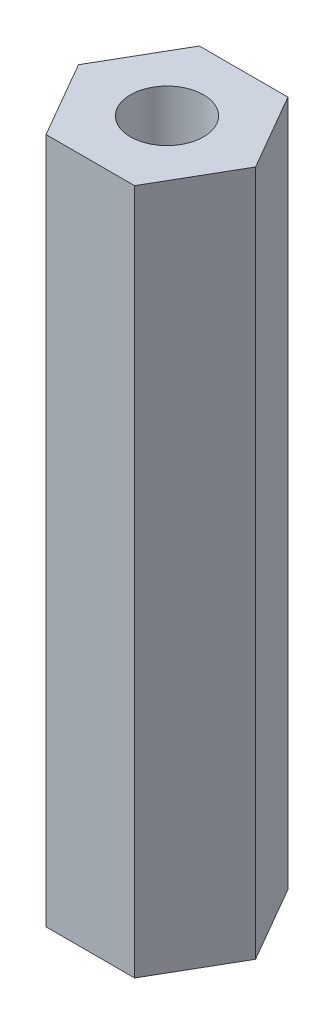
ISO-10303-21;
HEADER;
FILE_DESCRIPTION(('STEP AP214'),'2;1');
FILE_NAME('part.step','',(''),(''),'','','');
FILE_SCHEMA(('AUTOMOTIVE_DESIGN { 1 0 10303 214 1 1 1 1 }'));
ENDSEC;
DATA;
#1=APPLICATION_CONTEXT('core data for automotive mechanical design processes');
#2=APPLICATION_PROTOCOL_DEFINITION('international standard','automotive_design',2000,#1);
#3=PRODUCT_CONTEXT('',#1,'mechanical');
#4=PRODUCT('Part','Part','',(#3));
#5=PRODUCT_RELATED_PRODUCT_CATEGORY('part','',(#4));
#6=PRODUCT_DEFINITION_FORMATION('','',#4);
#7=PRODUCT_DEFINITION_CONTEXT('part definition',#1,'design');
#8=PRODUCT_DEFINITION('design','',#6,#7);
#9=PRODUCT_DEFINITION_SHAPE('','',#8);
#10=(LENGTH_UNIT() NAMED_UNIT(*) SI_UNIT(.MILLI.,.METRE.));
#11=(NAMED_UNIT(*) PLANE_ANGLE_UNIT() SI_UNIT($,.RADIAN.));
#12=(NAMED_UNIT(*) SI_UNIT($,.STERADIAN.) SOLID_ANGLE_UNIT());
#13=UNCERTAINTY_MEASURE_WITH_UNIT(LENGTH_MEASURE(1.E-05),#10,'distance_accuracy_value','');
#14=(GEOMETRIC_REPRESENTATION_CONTEXT(3) GLOBAL_UNCERTAINTY_ASSIGNED_CONTEXT((#13)) GLOBAL_UNIT_ASSIGNED_CONTEXT((#10,
#11,#12)) REPRESENTATION_CONTEXT('',''));
#15=CARTESIAN_POINT('',(0.,0.,0.));
#16=DIRECTION('',(0.,0.,1.));
#17=DIRECTION('',(1.,0.,0.));
#18=AXIS2_PLACEMENT_3D('',#15,#16,#17);
#19=CARTESIAN_POINT('',(2.,31.,3.46410161513776));
#20=DIRECTION('',(-0.866025403784439,0.,-0.5));
#21=DIRECTION('',(-0.5,0.,0.866025403784439));
#22=AXIS2_PLACEMENT_3D('',#19,#20,#21);
#23=PLANE('',#22);
#24=DIRECTION('',(0.5,0.,-0.866025403784439));
#25=VECTOR('',#24,1.);
#26=CARTESIAN_POINT('',(2.,0.,3.46410161513776));
#27=LINE('',#26,#25);
#28=CARTESIAN_POINT('',(2.,0.,3.46410161513776));
#29=VERTEX_POINT('',#28);
#30=CARTESIAN_POINT('',(4.,0.,0.));
#31=VERTEX_POINT('',#30);
#32=EDGE_CURVE('E116',#29,#31,#27,.T.);
#33=ORIENTED_EDGE('',*,*,#32,.T.);
#34=DIRECTION('',(0.,-1.,0.));
#35=VECTOR('',#34,1.);
#36=CARTESIAN_POINT('',(4.,31.,0.));
#37=LINE('',#36,#35);
#38=CARTESIAN_POINT('',(4.,31.,0.));
#39=VERTEX_POINT('',#38);
#40=EDGE_CURVE('E11',#39,#31,#37,.T.);
#41=ORIENTED_EDGE('',*,*,#40,.F.);
#42=DIRECTION('',(0.5,0.,-0.866025403784439));
#43=VECTOR('',#42,1.);
#44=CARTESIAN_POINT('',(2.,31.,3.46410161513776));
#45=LINE('',#44,#43);
#46=CARTESIAN_POINT('',(2.,31.,3.46410161513776));
#47=VERTEX_POINT('',#46);
#48=EDGE_CURVE('E127',#47,#39,#45,.T.);
#49=ORIENTED_EDGE('',*,*,#48,.F.);
#50=DIRECTION('',(0.,-1.,0.));
#51=VECTOR('',#50,1.);
#52=CARTESIAN_POINT('',(2.,31.,3.46410161513776));
#53=LINE('',#52,#51);
#54=EDGE_CURVE('E112',#47,#29,#53,.T.);
#55=ORIENTED_EDGE('',*,*,#54,.T.);
#56=EDGE_LOOP('',(#33,#41,#49,#55));
#57=FACE_BOUND('',#56,.T.);
#58=ADVANCED_FACE('F32',(#57),#23,.F.);
#59=CARTESIAN_POINT('',(4.,31.,0.));
#60=DIRECTION('',(-0.866025403784439,0.,0.5));
#61=DIRECTION('',(0.5,0.,0.866025403784439));
#62=AXIS2_PLACEMENT_3D('',#59,#60,#61);
#63=PLANE('',#62);
#64=DIRECTION('',(-0.5,0.,-0.866025403784439));
#65=VECTOR('',#64,1.);
#66=CARTESIAN_POINT('',(4.,0.,0.));
#67=LINE('',#66,#65);
#68=CARTESIAN_POINT('',(2.,0.,-3.46410161513776));
#69=VERTEX_POINT('',#68);
#70=EDGE_CURVE('E119',#31,#69,#67,.T.);
#71=ORIENTED_EDGE('',*,*,#70,.T.);
#72=DIRECTION('',(0.,-1.,0.));
#73=VECTOR('',#72,1.);
#74=CARTESIAN_POINT('',(2.,31.,-3.46410161513776));
#75=LINE('',#74,#73);
#76=CARTESIAN_POINT('',(2.,31.,-3.46410161513776));
#77=VERTEX_POINT('',#76);
#78=EDGE_CURVE('E40',#77,#69,#75,.T.);
#79=ORIENTED_EDGE('',*,*,#78,.F.);
#80=DIRECTION('',(-0.5,0.,-0.866025403784439));
#81=VECTOR('',#80,1.);
#82=CARTESIAN_POINT('',(4.,31.,0.));
#83=LINE('',#82,#81);
#84=EDGE_CURVE('E85',#39,#77,#83,.T.);
#85=ORIENTED_EDGE('',*,*,#84,.F.);
#86=ORIENTED_EDGE('',*,*,#40,.T.);
#87=EDGE_LOOP('',(#71,#79,#85,#86));
#88=FACE_BOUND('',#87,.T.);
#89=ADVANCED_FACE('F152',(#88),#63,.F.);
#90=CARTESIAN_POINT('',(2.,31.,-3.46410161513776));
#91=DIRECTION('',(0.,0.,1.));
#92=DIRECTION('',(1.,0.,0.));
#93=AXIS2_PLACEMENT_3D('',#90,#91,#92);
#94=PLANE('',#93);
#95=DIRECTION('',(-1.,0.,0.));
#96=VECTOR('',#95,1.);
#97=CARTESIAN_POINT('',(2.,0.,-3.46410161513776));
#98=LINE('',#97,#96);
#99=CARTESIAN_POINT('',(-2.,0.,-3.46410161513776));
#100=VERTEX_POINT('',#99);
#101=EDGE_CURVE('E122',#69,#100,#98,.T.);
#102=ORIENTED_EDGE('',*,*,#101,.T.);
#103=DIRECTION('',(0.,-1.,0.));
#104=VECTOR('',#103,1.);
#105=CARTESIAN_POINT('',(-2.,31.,-3.46410161513776));
#106=LINE('',#105,#104);
#107=CARTESIAN_POINT('',(-2.,31.,-3.46410161513776));
#108=VERTEX_POINT('',#107);
#109=EDGE_CURVE('E107',#108,#100,#106,.T.);
#110=ORIENTED_EDGE('',*,*,#109,.F.);
#111=DIRECTION('',(-1.,0.,0.));
#112=VECTOR('',#111,1.);
#113=CARTESIAN_POINT('',(2.,31.,-3.46410161513776));
#114=LINE('',#113,#112);
#115=EDGE_CURVE('E98',#77,#108,#114,.T.);
#116=ORIENTED_EDGE('',*,*,#115,.F.);
#117=ORIENTED_EDGE('',*,*,#78,.T.);
#118=EDGE_LOOP('',(#102,#110,#116,#117));
#119=FACE_BOUND('',#118,.T.);
#120=ADVANCED_FACE('F133',(#119),#94,.F.);
#121=CARTESIAN_POINT('',(-2.,31.,-3.46410161513776));
#122=DIRECTION('',(0.866025403784439,0.,0.5));
#123=DIRECTION('',(0.5,0.,-0.866025403784439));
#124=AXIS2_PLACEMENT_3D('',#121,#122,#123);
#125=PLANE('',#124);
#126=DIRECTION('',(-0.5,0.,0.866025403784439));
#127=VECTOR('',#126,1.);
#128=CARTESIAN_POINT('',(-2.,0.,-3.46410161513776));
#129=LINE('',#128,#127);
#130=CARTESIAN_POINT('',(-4.,0.,0.));
#131=VERTEX_POINT('',#130);
#132=EDGE_CURVE('E106',#100,#131,#129,.T.);
#133=ORIENTED_EDGE('',*,*,#132,.T.);
#134=DIRECTION('',(0.,-1.,0.));
#135=VECTOR('',#134,1.);
#136=CARTESIAN_POINT('',(-4.,31.,0.));
#137=LINE('',#136,#135);
#138=CARTESIAN_POINT('',(-4.,31.,0.));
#139=VERTEX_POINT('',#138);
#140=EDGE_CURVE('E103',#139,#131,#137,.T.);
#141=ORIENTED_EDGE('',*,*,#140,.F.);
#142=DIRECTION('',(-0.5,0.,0.866025403784439));
#143=VECTOR('',#142,1.);
#144=CARTESIAN_POINT('',(-2.,31.,-3.46410161513776));
#145=LINE('',#144,#143);
#146=EDGE_CURVE('E92',#108,#139,#145,.T.);
#147=ORIENTED_EDGE('',*,*,#146,.F.);
#148=ORIENTED_EDGE('',*,*,#109,.T.);
#149=EDGE_LOOP('',(#133,#141,#147,#148));
#150=FACE_BOUND('',#149,.T.);
#151=ADVANCED_FACE('F104',(#150),#125,.F.);
#152=CARTESIAN_POINT('',(-4.,31.,0.));
#153=DIRECTION('',(0.866025403784438,0.,-0.5));
#154=DIRECTION('',(-0.5,0.,-0.866025403784439));
#155=AXIS2_PLACEMENT_3D('',#152,#153,#154);
#156=PLANE('',#155);
#157=DIRECTION('',(0.5,0.,0.866025403784438));
#158=VECTOR('',#157,1.);
#159=CARTESIAN_POINT('',(-4.,0.,0.));
#160=LINE('',#159,#158);
#161=CARTESIAN_POINT('',(-2.,0.,3.46410161513776));
#162=VERTEX_POINT('',#161);
#163=EDGE_CURVE('E71',#131,#162,#160,.T.);
#164=ORIENTED_EDGE('',*,*,#163,.T.);
#165=DIRECTION('',(0.,-1.,0.));
#166=VECTOR('',#165,1.);
#167=CARTESIAN_POINT('',(-2.,31.,3.46410161513776));
#168=LINE('',#167,#166);
#169=CARTESIAN_POINT('',(-2.,31.,3.46410161513776));
#170=VERTEX_POINT('',#169);
#171=EDGE_CURVE('E108',#170,#162,#168,.T.);
#172=ORIENTED_EDGE('',*,*,#171,.F.);
#173=DIRECTION('',(0.5,0.,0.866025403784438));
#174=VECTOR('',#173,1.);
#175=CARTESIAN_POINT('',(-4.,31.,0.));
#176=LINE('',#175,#174);
#177=EDGE_CURVE('E96',#139,#170,#176,.T.);
#178=ORIENTED_EDGE('',*,*,#177,.F.);
#179=ORIENTED_EDGE('',*,*,#140,.T.);
#180=EDGE_LOOP('',(#164,#172,#178,#179));
#181=FACE_BOUND('',#180,.T.);
#182=ADVANCED_FACE('F110',(#181),#156,.F.);
#183=CARTESIAN_POINT('',(-2.,31.,3.46410161513776));
#184=DIRECTION('',(0.,0.,-1.));
#185=DIRECTION('',(-1.,0.,0.));
#186=AXIS2_PLACEMENT_3D('',#183,#184,#185);
#187=PLANE('',#186);
#188=DIRECTION('',(1.,0.,0.));
#189=VECTOR('',#188,1.);
#190=CARTESIAN_POINT('',(-2.,0.,3.46410161513776));
#191=LINE('',#190,#189);
#192=EDGE_CURVE('E77',#162,#29,#191,.T.);
#193=ORIENTED_EDGE('',*,*,#192,.T.);
#194=ORIENTED_EDGE('',*,*,#54,.F.);
#195=DIRECTION('',(1.,0.,0.));
#196=VECTOR('',#195,1.);
#197=CARTESIAN_POINT('',(-2.,31.,3.46410161513776));
#198=LINE('',#197,#196);
#199=EDGE_CURVE('E48',#170,#47,#198,.T.);
#200=ORIENTED_EDGE('',*,*,#199,.F.);
#201=ORIENTED_EDGE('',*,*,#171,.T.);
#202=EDGE_LOOP('',(#193,#194,#200,#201));
#203=FACE_BOUND('',#202,.T.);
#204=ADVANCED_FACE('F140',(#203),#187,.F.);
#205=CARTESIAN_POINT('',(0.,31.,0.));
#206=DIRECTION('',(0.,1.,0.));
#207=DIRECTION('',(0.,0.,1.));
#208=AXIS2_PLACEMENT_3D('',#205,#206,#207);
#209=PLANE('',#208);
#210=CARTESIAN_POINT('',(0.,31.,0.));
#211=DIRECTION('',(0.,1.,0.));
#212=DIRECTION('',(0.,0.,1.));
#213=AXIS2_PLACEMENT_3D('',#210,#211,#212);
#214=CIRCLE('',#213,1.64999999999999);
#215=CARTESIAN_POINT('',(0.,31.,1.64999999999999));
#216=VERTEX_POINT('',#215);
#217=EDGE_CURVE('E207',#216,#216,#214,.T.);
#218=ORIENTED_EDGE('',*,*,#217,.F.);
#219=EDGE_LOOP('',(#218));
#220=FACE_BOUND('',#219,.T.);
#221=ORIENTED_EDGE('',*,*,#48,.T.);
#222=ORIENTED_EDGE('',*,*,#84,.T.);
#223=ORIENTED_EDGE('',*,*,#115,.T.);
#224=ORIENTED_EDGE('',*,*,#146,.T.);
#225=ORIENTED_EDGE('',*,*,#177,.T.);
#226=ORIENTED_EDGE('',*,*,#199,.T.);
#227=EDGE_LOOP('',(#221,#222,#223,#224,#225,#226));
#228=FACE_BOUND('',#227,.T.);
#229=ADVANCED_FACE('F94',(#220,#228),#209,.T.);
#230=CARTESIAN_POINT('',(0.,0.,0.));
#231=DIRECTION('',(0.,1.,0.));
#232=DIRECTION('',(0.,0.,1.));
#233=AXIS2_PLACEMENT_3D('',#230,#231,#232);
#234=PLANE('',#233);
#235=CARTESIAN_POINT('',(0.,0.,0.));
#236=DIRECTION('',(0.,1.,0.));
#237=DIRECTION('',(0.,0.,1.));
#238=AXIS2_PLACEMENT_3D('',#235,#236,#237);
#239=CIRCLE('',#238,1.64999999999999);
#240=CARTESIAN_POINT('',(0.,0.,1.64999999999999));
#241=VERTEX_POINT('',#240);
#242=EDGE_CURVE('E120',#241,#241,#239,.T.);
#243=ORIENTED_EDGE('',*,*,#242,.T.);
#244=EDGE_LOOP('',(#243));
#245=FACE_BOUND('',#244,.T.);
#246=ORIENTED_EDGE('',*,*,#32,.F.);
#247=ORIENTED_EDGE('',*,*,#192,.F.);
#248=ORIENTED_EDGE('',*,*,#163,.F.);
#249=ORIENTED_EDGE('',*,*,#132,.F.);
#250=ORIENTED_EDGE('',*,*,#101,.F.);
#251=ORIENTED_EDGE('',*,*,#70,.F.);
#252=EDGE_LOOP('',(#246,#247,#248,#249,#250,#251));
#253=FACE_BOUND('',#252,.T.);
#254=ADVANCED_FACE('F136',(#245,#253),#234,.F.);
#255=CARTESIAN_POINT('',(0.,31.,0.));
#256=DIRECTION('',(0.,1.,0.));
#257=DIRECTION('',(0.,0.,1.));
#258=AXIS2_PLACEMENT_3D('',#255,#256,#257);
#259=CYLINDRICAL_SURFACE('',#258,1.64999999999999);
#260=ORIENTED_EDGE('',*,*,#242,.F.);
#261=EDGE_LOOP('',(#260));
#262=FACE_BOUND('',#261,.T.);
#263=ORIENTED_EDGE('',*,*,#217,.T.);
#264=EDGE_LOOP('',(#263));
#265=FACE_BOUND('',#264,.T.);
#266=ADVANCED_FACE('F189',(#262,#265),#259,.F.);
#267=CLOSED_SHELL('',(#58,#89,#120,#151,#182,#204,#229,#254,#266));
#268=MANIFOLD_SOLID_BREP('B2',#267);
#269=ADVANCED_BREP_SHAPE_REPRESENTATION('',(#18,#268),#14);
#270=SHAPE_DEFINITION_REPRESENTATION(#9,#269);
ENDSEC;
END-ISO-10303-21;
